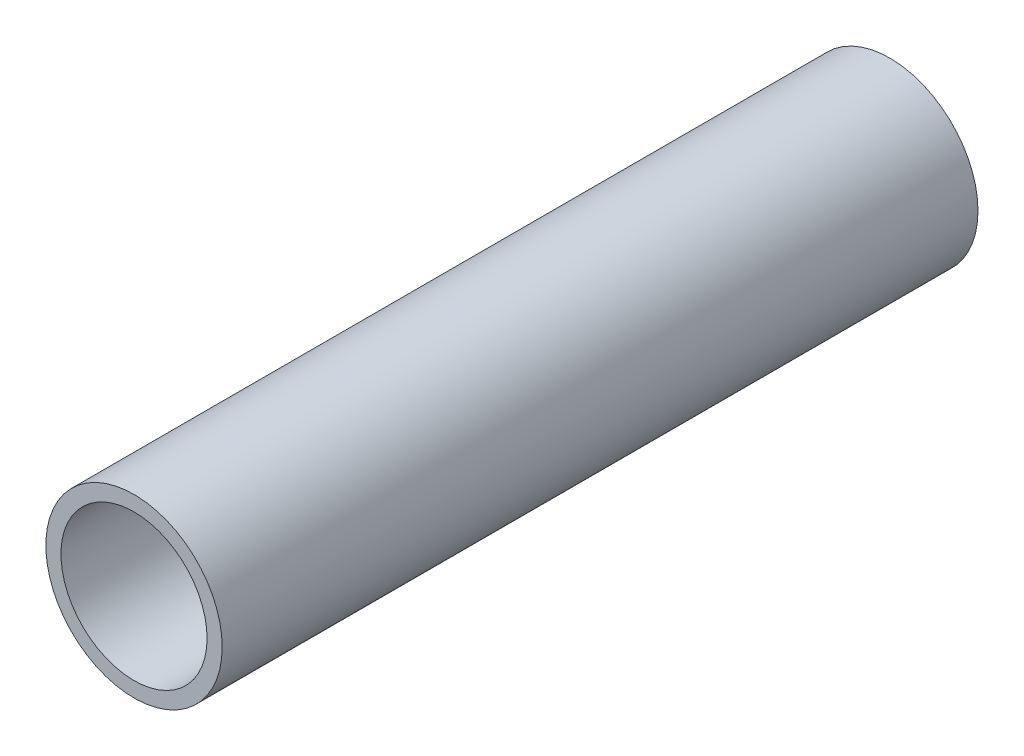
ISO-10303-21;
HEADER;
FILE_DESCRIPTION(('STEP AP214'),'2;1');
FILE_NAME('part.step','',(''),(''),'','','');
FILE_SCHEMA(('AUTOMOTIVE_DESIGN { 1 0 10303 214 1 1 1 1 }'));
ENDSEC;
DATA;
#1=APPLICATION_CONTEXT('core data for automotive mechanical design processes');
#2=APPLICATION_PROTOCOL_DEFINITION('international standard','automotive_design',2000,#1);
#3=PRODUCT_CONTEXT('',#1,'mechanical');
#4=PRODUCT('Part','Part','',(#3));
#5=PRODUCT_RELATED_PRODUCT_CATEGORY('part','',(#4));
#6=PRODUCT_DEFINITION_FORMATION('','',#4);
#7=PRODUCT_DEFINITION_CONTEXT('part definition',#1,'design');
#8=PRODUCT_DEFINITION('design','',#6,#7);
#9=PRODUCT_DEFINITION_SHAPE('','',#8);
#10=(LENGTH_UNIT() NAMED_UNIT(*) SI_UNIT(.MILLI.,.METRE.));
#11=(NAMED_UNIT(*) PLANE_ANGLE_UNIT() SI_UNIT($,.RADIAN.));
#12=(NAMED_UNIT(*) SI_UNIT($,.STERADIAN.) SOLID_ANGLE_UNIT());
#13=UNCERTAINTY_MEASURE_WITH_UNIT(LENGTH_MEASURE(1.E-05),#10,'distance_accuracy_value','');
#14=(GEOMETRIC_REPRESENTATION_CONTEXT(3) GLOBAL_UNCERTAINTY_ASSIGNED_CONTEXT((#13)) GLOBAL_UNIT_ASSIGNED_CONTEXT((#10,
#11,#12)) REPRESENTATION_CONTEXT('',''));
#15=CARTESIAN_POINT('',(0.,0.,0.));
#16=DIRECTION('',(0.,0.,1.));
#17=DIRECTION('',(1.,0.,0.));
#18=AXIS2_PLACEMENT_3D('',#15,#16,#17);
#19=CARTESIAN_POINT('',(0.,0.,15.));
#20=DIRECTION('',(0.,0.,1.));
#21=DIRECTION('',(1.,0.,0.));
#22=AXIS2_PLACEMENT_3D('',#19,#20,#21);
#23=PLANE('',#22);
#24=CARTESIAN_POINT('',(0.,0.,15.));
#25=DIRECTION('',(0.,0.,1.));
#26=DIRECTION('',(1.,0.,0.));
#27=AXIS2_PLACEMENT_3D('',#24,#25,#26);
#28=CIRCLE('',#27,1.75);
#29=CARTESIAN_POINT('',(1.75,0.,15.));
#30=VERTEX_POINT('',#29);
#31=EDGE_CURVE('E10',#30,#30,#28,.T.);
#32=ORIENTED_EDGE('',*,*,#31,.T.);
#33=EDGE_LOOP('',(#32));
#34=FACE_BOUND('',#33,.T.);
#35=CARTESIAN_POINT('',(0.,0.,15.));
#36=DIRECTION('',(0.,0.,1.));
#37=DIRECTION('',(1.,0.,0.));
#38=AXIS2_PLACEMENT_3D('',#35,#36,#37);
#39=CIRCLE('',#38,1.45);
#40=CARTESIAN_POINT('',(1.45,0.,15.));
#41=VERTEX_POINT('',#40);
#42=EDGE_CURVE('E44',#41,#41,#39,.T.);
#43=ORIENTED_EDGE('',*,*,#42,.F.);
#44=EDGE_LOOP('',(#43));
#45=FACE_BOUND('',#44,.T.);
#46=ADVANCED_FACE('F33',(#34,#45),#23,.T.);
#47=CARTESIAN_POINT('',(0.,0.,0.));
#48=DIRECTION('',(0.,0.,1.));
#49=DIRECTION('',(1.,0.,0.));
#50=AXIS2_PLACEMENT_3D('',#47,#48,#49);
#51=PLANE('',#50);
#52=CARTESIAN_POINT('',(0.,0.,0.));
#53=DIRECTION('',(0.,0.,1.));
#54=DIRECTION('',(1.,0.,0.));
#55=AXIS2_PLACEMENT_3D('',#52,#53,#54);
#56=CIRCLE('',#55,1.75);
#57=CARTESIAN_POINT('',(1.75,0.,0.));
#58=VERTEX_POINT('',#57);
#59=EDGE_CURVE('E37',#58,#58,#56,.T.);
#60=ORIENTED_EDGE('',*,*,#59,.F.);
#61=EDGE_LOOP('',(#60));
#62=FACE_BOUND('',#61,.T.);
#63=CARTESIAN_POINT('',(0.,0.,0.));
#64=DIRECTION('',(0.,0.,1.));
#65=DIRECTION('',(1.,0.,0.));
#66=AXIS2_PLACEMENT_3D('',#63,#64,#65);
#67=CIRCLE('',#66,1.45);
#68=CARTESIAN_POINT('',(1.45,0.,0.));
#69=VERTEX_POINT('',#68);
#70=EDGE_CURVE('E46',#69,#69,#67,.T.);
#71=ORIENTED_EDGE('',*,*,#70,.T.);
#72=EDGE_LOOP('',(#71));
#73=FACE_BOUND('',#72,.T.);
#74=ADVANCED_FACE('F56',(#62,#73),#51,.F.);
#75=CARTESIAN_POINT('',(0.,0.,15.));
#76=DIRECTION('',(0.,0.,-1.));
#77=DIRECTION('',(-1.,0.,0.));
#78=AXIS2_PLACEMENT_3D('',#75,#76,#77);
#79=CYLINDRICAL_SURFACE('',#78,1.75);
#80=ORIENTED_EDGE('',*,*,#31,.F.);
#81=EDGE_LOOP('',(#80));
#82=FACE_BOUND('',#81,.T.);
#83=ORIENTED_EDGE('',*,*,#59,.T.);
#84=EDGE_LOOP('',(#83));
#85=FACE_BOUND('',#84,.T.);
#86=ADVANCED_FACE('F35',(#82,#85),#79,.T.);
#87=CARTESIAN_POINT('',(0.,0.,15.));
#88=DIRECTION('',(0.,0.,-1.));
#89=DIRECTION('',(-1.,0.,0.));
#90=AXIS2_PLACEMENT_3D('',#87,#88,#89);
#91=CYLINDRICAL_SURFACE('',#90,1.45);
#92=ORIENTED_EDGE('',*,*,#42,.T.);
#93=EDGE_LOOP('',(#92));
#94=FACE_BOUND('',#93,.T.);
#95=ORIENTED_EDGE('',*,*,#70,.F.);
#96=EDGE_LOOP('',(#95));
#97=FACE_BOUND('',#96,.T.);
#98=ADVANCED_FACE('F52',(#94,#97),#91,.F.);
#99=CLOSED_SHELL('',(#46,#74,#86,#98));
#100=MANIFOLD_SOLID_BREP('B2',#99);
#101=ADVANCED_BREP_SHAPE_REPRESENTATION('',(#18,#100),#14);
#102=SHAPE_DEFINITION_REPRESENTATION(#9,#101);
ENDSEC;
END-ISO-10303-21;
